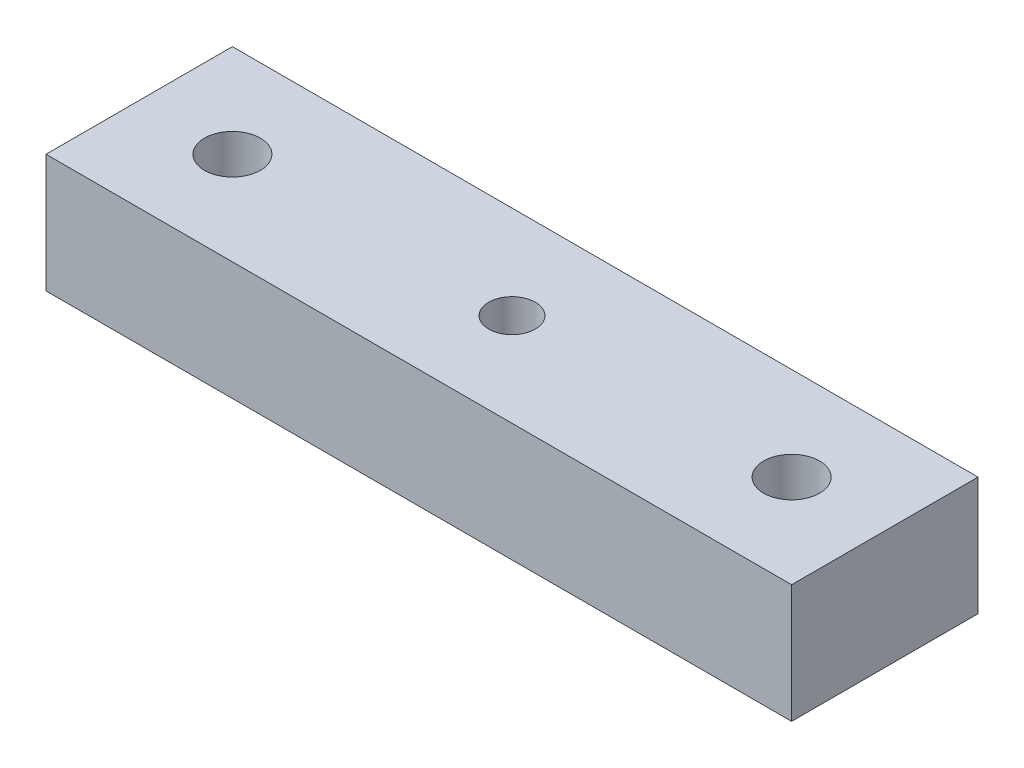
ISO-10303-21;
HEADER;
FILE_DESCRIPTION(('STEP AP214'),'2;1');
FILE_NAME('part.step','',(''),(''),'','','');
FILE_SCHEMA(('AUTOMOTIVE_DESIGN { 1 0 10303 214 1 1 1 1 }'));
ENDSEC;
DATA;
#1=APPLICATION_CONTEXT('core data for automotive mechanical design processes');
#2=APPLICATION_PROTOCOL_DEFINITION('international standard','automotive_design',2000,#1);
#3=PRODUCT_CONTEXT('',#1,'mechanical');
#4=PRODUCT('Part','Part','',(#3));
#5=PRODUCT_RELATED_PRODUCT_CATEGORY('part','',(#4));
#6=PRODUCT_DEFINITION_FORMATION('','',#4);
#7=PRODUCT_DEFINITION_CONTEXT('part definition',#1,'design');
#8=PRODUCT_DEFINITION('design','',#6,#7);
#9=PRODUCT_DEFINITION_SHAPE('','',#8);
#10=(LENGTH_UNIT() NAMED_UNIT(*) SI_UNIT(.MILLI.,.METRE.));
#11=(NAMED_UNIT(*) PLANE_ANGLE_UNIT() SI_UNIT($,.RADIAN.));
#12=(NAMED_UNIT(*) SI_UNIT($,.STERADIAN.) SOLID_ANGLE_UNIT());
#13=UNCERTAINTY_MEASURE_WITH_UNIT(LENGTH_MEASURE(1.E-05),#10,'distance_accuracy_value','');
#14=(GEOMETRIC_REPRESENTATION_CONTEXT(3) GLOBAL_UNCERTAINTY_ASSIGNED_CONTEXT((#13)) GLOBAL_UNIT_ASSIGNED_CONTEXT((#10,
#11,#12)) REPRESENTATION_CONTEXT('',''));
#15=CARTESIAN_POINT('',(0.,0.,0.));
#16=DIRECTION('',(0.,0.,1.));
#17=DIRECTION('',(1.,0.,0.));
#18=AXIS2_PLACEMENT_3D('',#15,#16,#17);
#19=CARTESIAN_POINT('',(0.,6.35,0.));
#20=DIRECTION('',(0.,-1.,0.));
#21=DIRECTION('',(0.,0.,-1.));
#22=AXIS2_PLACEMENT_3D('',#19,#20,#21);
#23=PLANE('',#22);
#24=DIRECTION('',(0.,0.,-1.));
#25=VECTOR('',#24,1.);
#26=CARTESIAN_POINT('',(40.,6.35,10.));
#27=LINE('',#26,#25);
#28=CARTESIAN_POINT('',(40.,6.35,10.));
#29=VERTEX_POINT('',#28);
#30=CARTESIAN_POINT('',(40.,6.35,-10.));
#31=VERTEX_POINT('',#30);
#32=EDGE_CURVE('E85',#29,#31,#27,.T.);
#33=ORIENTED_EDGE('',*,*,#32,.T.);
#34=DIRECTION('',(-1.,0.,0.));
#35=VECTOR('',#34,1.);
#36=CARTESIAN_POINT('',(-40.,6.35,-10.));
#37=LINE('',#36,#35);
#38=CARTESIAN_POINT('',(-40.,6.35,-10.));
#39=VERTEX_POINT('',#38);
#40=EDGE_CURVE('E80',#31,#39,#37,.T.);
#41=ORIENTED_EDGE('',*,*,#40,.T.);
#42=DIRECTION('',(0.,0.,1.));
#43=VECTOR('',#42,1.);
#44=CARTESIAN_POINT('',(-40.,6.35,10.));
#45=LINE('',#44,#43);
#46=CARTESIAN_POINT('',(-40.,6.35,10.));
#47=VERTEX_POINT('',#46);
#48=EDGE_CURVE('E83',#39,#47,#45,.T.);
#49=ORIENTED_EDGE('',*,*,#48,.T.);
#50=DIRECTION('',(1.,0.,0.));
#51=VECTOR('',#50,1.);
#52=CARTESIAN_POINT('',(-40.,6.35,10.));
#53=LINE('',#52,#51);
#54=EDGE_CURVE('E50',#47,#29,#53,.T.);
#55=ORIENTED_EDGE('',*,*,#54,.T.);
#56=EDGE_LOOP('',(#33,#41,#49,#55));
#57=FACE_BOUND('',#56,.T.);
#58=CARTESIAN_POINT('',(0.,6.35,0.));
#59=DIRECTION('',(0.,1.,0.));
#60=DIRECTION('',(0.,0.,1.));
#61=AXIS2_PLACEMENT_3D('',#58,#59,#60);
#62=CIRCLE('',#61,2.5);
#63=CARTESIAN_POINT('',(0.,6.35,2.5));
#64=VERTEX_POINT('',#63);
#65=EDGE_CURVE('E100',#64,#64,#62,.T.);
#66=ORIENTED_EDGE('',*,*,#65,.F.);
#67=EDGE_LOOP('',(#66));
#68=FACE_BOUND('',#67,.T.);
#69=CARTESIAN_POINT('',(-30.,6.35,0.));
#70=DIRECTION('',(0.,1.,0.));
#71=DIRECTION('',(0.,0.,1.));
#72=AXIS2_PLACEMENT_3D('',#69,#70,#71);
#73=CIRCLE('',#72,3.);
#74=CARTESIAN_POINT('',(-30.,6.35,3.));
#75=VERTEX_POINT('',#74);
#76=EDGE_CURVE('E115',#75,#75,#73,.T.);
#77=ORIENTED_EDGE('',*,*,#76,.F.);
#78=EDGE_LOOP('',(#77));
#79=FACE_BOUND('',#78,.T.);
#80=CARTESIAN_POINT('',(30.,6.35,0.));
#81=DIRECTION('',(0.,1.,0.));
#82=DIRECTION('',(0.,0.,1.));
#83=AXIS2_PLACEMENT_3D('',#80,#81,#82);
#84=CIRCLE('',#83,3.);
#85=CARTESIAN_POINT('',(30.,6.35,2.99999999999999));
#86=VERTEX_POINT('',#85);
#87=EDGE_CURVE('E121',#86,#86,#84,.T.);
#88=ORIENTED_EDGE('',*,*,#87,.F.);
#89=EDGE_LOOP('',(#88));
#90=FACE_BOUND('',#89,.T.);
#91=ADVANCED_FACE('F33',(#57,#68,#79,#90),#23,.F.);
#92=CARTESIAN_POINT('',(0.,-6.35,0.));
#93=DIRECTION('',(0.,-1.,0.));
#94=DIRECTION('',(0.,0.,-1.));
#95=AXIS2_PLACEMENT_3D('',#92,#93,#94);
#96=PLANE('',#95);
#97=CARTESIAN_POINT('',(-30.,-6.35,0.));
#98=DIRECTION('',(0.,1.,0.));
#99=DIRECTION('',(0.,0.,1.));
#100=AXIS2_PLACEMENT_3D('',#97,#98,#99);
#101=CIRCLE('',#100,3.);
#102=CARTESIAN_POINT('',(-30.,-6.35,3.));
#103=VERTEX_POINT('',#102);
#104=EDGE_CURVE('E118',#103,#103,#101,.T.);
#105=ORIENTED_EDGE('',*,*,#104,.T.);
#106=EDGE_LOOP('',(#105));
#107=FACE_BOUND('',#106,.T.);
#108=DIRECTION('',(0.,0.,-1.));
#109=VECTOR('',#108,1.);
#110=CARTESIAN_POINT('',(40.,-6.35,10.));
#111=LINE('',#110,#109);
#112=CARTESIAN_POINT('',(40.,-6.35,10.));
#113=VERTEX_POINT('',#112);
#114=CARTESIAN_POINT('',(40.,-6.35,-10.));
#115=VERTEX_POINT('',#114);
#116=EDGE_CURVE('E97',#113,#115,#111,.T.);
#117=ORIENTED_EDGE('',*,*,#116,.F.);
#118=DIRECTION('',(1.,0.,0.));
#119=VECTOR('',#118,1.);
#120=CARTESIAN_POINT('',(-40.,-6.35,10.));
#121=LINE('',#120,#119);
#122=CARTESIAN_POINT('',(-40.,-6.35,10.));
#123=VERTEX_POINT('',#122);
#124=EDGE_CURVE('E73',#123,#113,#121,.T.);
#125=ORIENTED_EDGE('',*,*,#124,.F.);
#126=DIRECTION('',(0.,0.,1.));
#127=VECTOR('',#126,1.);
#128=CARTESIAN_POINT('',(-40.,-6.35,10.));
#129=LINE('',#128,#127);
#130=CARTESIAN_POINT('',(-40.,-6.35,-10.));
#131=VERTEX_POINT('',#130);
#132=EDGE_CURVE('E67',#131,#123,#129,.T.);
#133=ORIENTED_EDGE('',*,*,#132,.F.);
#134=DIRECTION('',(-1.,0.,0.));
#135=VECTOR('',#134,1.);
#136=CARTESIAN_POINT('',(-40.,-6.35,-10.));
#137=LINE('',#136,#135);
#138=EDGE_CURVE('E89',#115,#131,#137,.T.);
#139=ORIENTED_EDGE('',*,*,#138,.F.);
#140=EDGE_LOOP('',(#117,#125,#133,#139));
#141=FACE_BOUND('',#140,.T.);
#142=CARTESIAN_POINT('',(0.,-6.35,0.));
#143=DIRECTION('',(0.,1.,0.));
#144=DIRECTION('',(0.,0.,1.));
#145=AXIS2_PLACEMENT_3D('',#142,#143,#144);
#146=CIRCLE('',#145,2.5);
#147=CARTESIAN_POINT('',(0.,-6.35,2.5));
#148=VERTEX_POINT('',#147);
#149=EDGE_CURVE('E112',#148,#148,#146,.T.);
#150=ORIENTED_EDGE('',*,*,#149,.T.);
#151=EDGE_LOOP('',(#150));
#152=FACE_BOUND('',#151,.T.);
#153=CARTESIAN_POINT('',(30.,-6.35,0.));
#154=DIRECTION('',(0.,1.,0.));
#155=DIRECTION('',(0.,0.,1.));
#156=AXIS2_PLACEMENT_3D('',#153,#154,#155);
#157=CIRCLE('',#156,3.);
#158=CARTESIAN_POINT('',(30.,-6.35,2.99999999999999));
#159=VERTEX_POINT('',#158);
#160=EDGE_CURVE('E124',#159,#159,#157,.T.);
#161=ORIENTED_EDGE('',*,*,#160,.T.);
#162=EDGE_LOOP('',(#161));
#163=FACE_BOUND('',#162,.T.);
#164=ADVANCED_FACE('F108',(#107,#141,#152,#163),#96,.T.);
#165=CARTESIAN_POINT('',(40.,6.35,10.));
#166=DIRECTION('',(-1.,0.,0.));
#167=DIRECTION('',(0.,0.,1.));
#168=AXIS2_PLACEMENT_3D('',#165,#166,#167);
#169=PLANE('',#168);
#170=ORIENTED_EDGE('',*,*,#116,.T.);
#171=DIRECTION('',(0.,-1.,0.));
#172=VECTOR('',#171,1.);
#173=CARTESIAN_POINT('',(40.,6.35,-10.));
#174=LINE('',#173,#172);
#175=EDGE_CURVE('E11',#31,#115,#174,.T.);
#176=ORIENTED_EDGE('',*,*,#175,.F.);
#177=ORIENTED_EDGE('',*,*,#32,.F.);
#178=DIRECTION('',(0.,-1.,0.));
#179=VECTOR('',#178,1.);
#180=CARTESIAN_POINT('',(40.,6.35,10.));
#181=LINE('',#180,#179);
#182=EDGE_CURVE('E93',#29,#113,#181,.T.);
#183=ORIENTED_EDGE('',*,*,#182,.T.);
#184=EDGE_LOOP('',(#170,#176,#177,#183));
#185=FACE_BOUND('',#184,.T.);
#186=ADVANCED_FACE('F35',(#185),#169,.F.);
#187=CARTESIAN_POINT('',(-40.,6.35,-10.));
#188=DIRECTION('',(0.,0.,1.));
#189=DIRECTION('',(1.,0.,0.));
#190=AXIS2_PLACEMENT_3D('',#187,#188,#189);
#191=PLANE('',#190);
#192=ORIENTED_EDGE('',*,*,#138,.T.);
#193=DIRECTION('',(0.,-1.,0.));
#194=VECTOR('',#193,1.);
#195=CARTESIAN_POINT('',(-40.,6.35,-10.));
#196=LINE('',#195,#194);
#197=EDGE_CURVE('E42',#39,#131,#196,.T.);
#198=ORIENTED_EDGE('',*,*,#197,.F.);
#199=ORIENTED_EDGE('',*,*,#40,.F.);
#200=ORIENTED_EDGE('',*,*,#175,.T.);
#201=EDGE_LOOP('',(#192,#198,#199,#200));
#202=FACE_BOUND('',#201,.T.);
#203=ADVANCED_FACE('F88',(#202),#191,.F.);
#204=CARTESIAN_POINT('',(-40.,6.35,10.));
#205=DIRECTION('',(1.,0.,0.));
#206=DIRECTION('',(0.,0.,-1.));
#207=AXIS2_PLACEMENT_3D('',#204,#205,#206);
#208=PLANE('',#207);
#209=ORIENTED_EDGE('',*,*,#132,.T.);
#210=DIRECTION('',(0.,-1.,0.));
#211=VECTOR('',#210,1.);
#212=CARTESIAN_POINT('',(-40.,6.35,10.));
#213=LINE('',#212,#211);
#214=EDGE_CURVE('E90',#47,#123,#213,.T.);
#215=ORIENTED_EDGE('',*,*,#214,.F.);
#216=ORIENTED_EDGE('',*,*,#48,.F.);
#217=ORIENTED_EDGE('',*,*,#197,.T.);
#218=EDGE_LOOP('',(#209,#215,#216,#217));
#219=FACE_BOUND('',#218,.T.);
#220=ADVANCED_FACE('F91',(#219),#208,.F.);
#221=CARTESIAN_POINT('',(-40.,6.35,10.));
#222=DIRECTION('',(0.,0.,-1.));
#223=DIRECTION('',(-1.,0.,0.));
#224=AXIS2_PLACEMENT_3D('',#221,#222,#223);
#225=PLANE('',#224);
#226=ORIENTED_EDGE('',*,*,#124,.T.);
#227=ORIENTED_EDGE('',*,*,#182,.F.);
#228=ORIENTED_EDGE('',*,*,#54,.F.);
#229=ORIENTED_EDGE('',*,*,#214,.T.);
#230=EDGE_LOOP('',(#226,#227,#228,#229));
#231=FACE_BOUND('',#230,.T.);
#232=ADVANCED_FACE('F105',(#231),#225,.F.);
#233=CARTESIAN_POINT('',(0.,6.35,0.));
#234=DIRECTION('',(0.,-1.,0.));
#235=DIRECTION('',(0.,0.,-1.));
#236=AXIS2_PLACEMENT_3D('',#233,#234,#235);
#237=CYLINDRICAL_SURFACE('',#236,2.5);
#238=ORIENTED_EDGE('',*,*,#65,.T.);
#239=EDGE_LOOP('',(#238));
#240=FACE_BOUND('',#239,.T.);
#241=ORIENTED_EDGE('',*,*,#149,.F.);
#242=EDGE_LOOP('',(#241));
#243=FACE_BOUND('',#242,.T.);
#244=ADVANCED_FACE('F141',(#240,#243),#237,.F.);
#245=CARTESIAN_POINT('',(-30.,6.35,0.));
#246=DIRECTION('',(0.,-1.,0.));
#247=DIRECTION('',(0.,0.,-1.));
#248=AXIS2_PLACEMENT_3D('',#245,#246,#247);
#249=CYLINDRICAL_SURFACE('',#248,3.);
#250=ORIENTED_EDGE('',*,*,#76,.T.);
#251=EDGE_LOOP('',(#250));
#252=FACE_BOUND('',#251,.T.);
#253=ORIENTED_EDGE('',*,*,#104,.F.);
#254=EDGE_LOOP('',(#253));
#255=FACE_BOUND('',#254,.T.);
#256=ADVANCED_FACE('F187',(#252,#255),#249,.F.);
#257=CARTESIAN_POINT('',(30.,6.35,0.));
#258=DIRECTION('',(0.,-1.,0.));
#259=DIRECTION('',(0.,0.,-1.));
#260=AXIS2_PLACEMENT_3D('',#257,#258,#259);
#261=CYLINDRICAL_SURFACE('',#260,3.);
#262=ORIENTED_EDGE('',*,*,#87,.T.);
#263=EDGE_LOOP('',(#262));
#264=FACE_BOUND('',#263,.T.);
#265=ORIENTED_EDGE('',*,*,#160,.F.);
#266=EDGE_LOOP('',(#265));
#267=FACE_BOUND('',#266,.T.);
#268=ADVANCED_FACE('F130',(#264,#267),#261,.F.);
#269=CLOSED_SHELL('',(#91,#164,#186,#203,#220,#232,#244,#256,#268));
#270=MANIFOLD_SOLID_BREP('B2',#269);
#271=ADVANCED_BREP_SHAPE_REPRESENTATION('',(#18,#270),#14);
#272=SHAPE_DEFINITION_REPRESENTATION(#9,#271);
ENDSEC;
END-ISO-10303-21;
